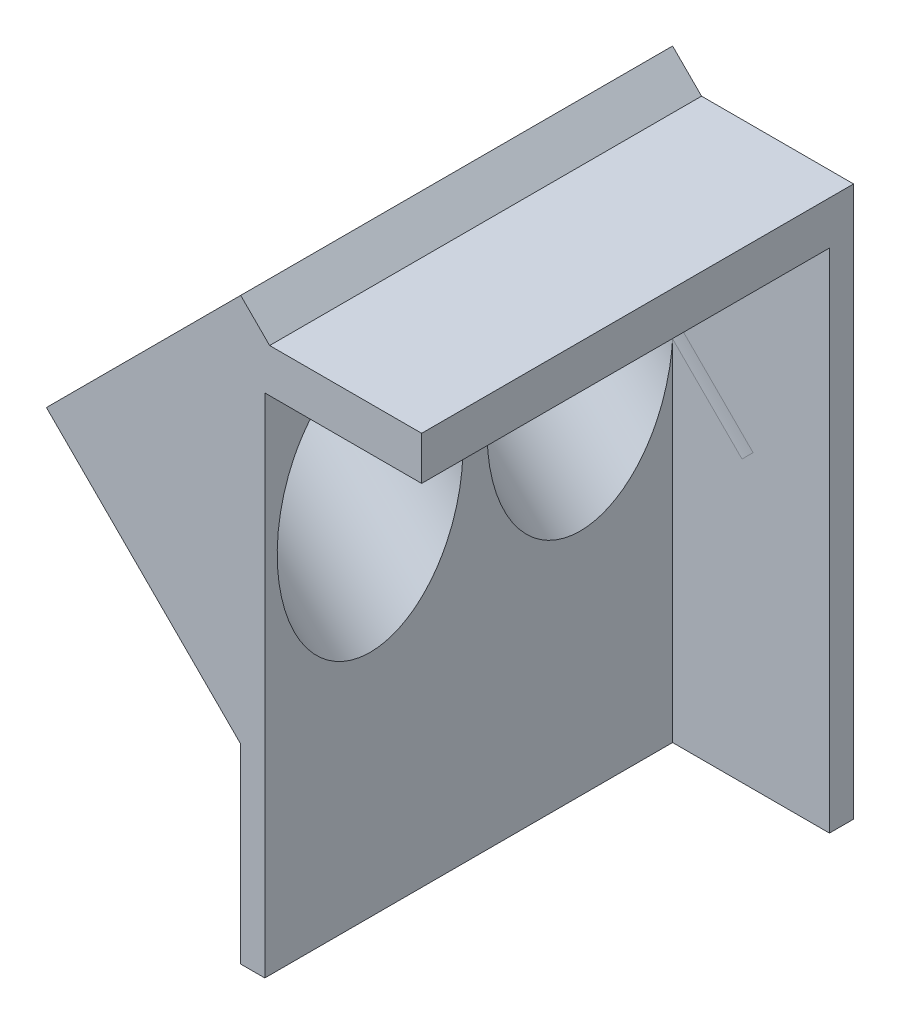
ISO-10303-21;
HEADER;
FILE_DESCRIPTION(('STEP AP214'),'2;1');
FILE_NAME('part.step','',(''),(''),'','','');
FILE_SCHEMA(('AUTOMOTIVE_DESIGN { 1 0 10303 214 1 1 1 1 }'));
ENDSEC;
DATA;
#1=APPLICATION_CONTEXT('core data for automotive mechanical design processes');
#2=APPLICATION_PROTOCOL_DEFINITION('international standard','automotive_design',2000,#1);
#3=PRODUCT_CONTEXT('',#1,'mechanical');
#4=PRODUCT('Part','Part','',(#3));
#5=PRODUCT_RELATED_PRODUCT_CATEGORY('part','',(#4));
#6=PRODUCT_DEFINITION_FORMATION('','',#4);
#7=PRODUCT_DEFINITION_CONTEXT('part definition',#1,'design');
#8=PRODUCT_DEFINITION('design','',#6,#7);
#9=PRODUCT_DEFINITION_SHAPE('','',#8);
#10=(LENGTH_UNIT() NAMED_UNIT(*) SI_UNIT(.MILLI.,.METRE.));
#11=(NAMED_UNIT(*) PLANE_ANGLE_UNIT() SI_UNIT($,.RADIAN.));
#12=(NAMED_UNIT(*) SI_UNIT($,.STERADIAN.) SOLID_ANGLE_UNIT());
#13=UNCERTAINTY_MEASURE_WITH_UNIT(LENGTH_MEASURE(1.E-05),#10,'distance_accuracy_value','');
#14=(GEOMETRIC_REPRESENTATION_CONTEXT(3) GLOBAL_UNCERTAINTY_ASSIGNED_CONTEXT((#13)) GLOBAL_UNIT_ASSIGNED_CONTEXT((#10,
#11,#12)) REPRESENTATION_CONTEXT('',''));
#15=CARTESIAN_POINT('',(0.,0.,0.));
#16=DIRECTION('',(0.,0.,1.));
#17=DIRECTION('',(1.,0.,0.));
#18=AXIS2_PLACEMENT_3D('',#15,#16,#17);
#19=CARTESIAN_POINT('',(103.,0.,0.));
#20=DIRECTION('',(1.,0.,0.));
#21=DIRECTION('',(0.,0.,-1.));
#22=AXIS2_PLACEMENT_3D('',#19,#20,#21);
#23=PLANE('',#22);
#24=DIRECTION('',(0.,0.,1.));
#25=VECTOR('',#24,1.);
#26=CARTESIAN_POINT('',(103.,-150.,0.));
#27=LINE('',#26,#25);
#28=CARTESIAN_POINT('',(103.,-150.,-179.));
#29=VERTEX_POINT('',#28);
#30=CARTESIAN_POINT('',(103.,-150.,-169.));
#31=VERTEX_POINT('',#30);
#32=EDGE_CURVE('E151',#29,#31,#27,.T.);
#33=ORIENTED_EDGE('',*,*,#32,.F.);
#34=DIRECTION('',(0.,1.,0.));
#35=VECTOR('',#34,1.);
#36=CARTESIAN_POINT('',(103.,90.0000000000001,-179.));
#37=LINE('',#36,#35);
#38=CARTESIAN_POINT('',(103.,78.0000000000001,-179.));
#39=VERTEX_POINT('',#38);
#40=EDGE_CURVE('E152',#29,#39,#37,.T.);
#41=ORIENTED_EDGE('',*,*,#40,.T.);
#42=DIRECTION('',(0.,0.,1.));
#43=VECTOR('',#42,1.);
#44=CARTESIAN_POINT('',(103.,78.0000000000001,0.));
#45=LINE('',#44,#43);
#46=CARTESIAN_POINT('',(103.,78.0000000000001,0.));
#47=VERTEX_POINT('',#46);
#48=EDGE_CURVE('E136',#39,#47,#45,.T.);
#49=ORIENTED_EDGE('',*,*,#48,.T.);
#50=DIRECTION('',(0.,-1.,0.));
#51=VECTOR('',#50,1.);
#52=CARTESIAN_POINT('',(103.,0.,0.));
#53=LINE('',#52,#51);
#54=CARTESIAN_POINT('',(103.,60.0000000000001,0.));
#55=VERTEX_POINT('',#54);
#56=EDGE_CURVE('E146',#47,#55,#53,.T.);
#57=ORIENTED_EDGE('',*,*,#56,.T.);
#58=DIRECTION('',(0.,0.,1.));
#59=VECTOR('',#58,1.);
#60=CARTESIAN_POINT('',(103.,60.0000000000001,0.));
#61=LINE('',#60,#59);
#62=CARTESIAN_POINT('',(103.,60.0000000000001,-169.));
#63=VERTEX_POINT('',#62);
#64=EDGE_CURVE('E162',#63,#55,#61,.T.);
#65=ORIENTED_EDGE('',*,*,#64,.F.);
#66=DIRECTION('',(0.,1.,0.));
#67=VECTOR('',#66,1.);
#68=CARTESIAN_POINT('',(103.,60.0000000000001,-169.));
#69=LINE('',#68,#67);
#70=EDGE_CURVE('E185',#31,#63,#69,.T.);
#71=ORIENTED_EDGE('',*,*,#70,.F.);
#72=EDGE_LOOP('',(#33,#41,#49,#57,#65,#71));
#73=FACE_BOUND('',#72,.T.);
#74=ADVANCED_FACE('F40',(#73),#23,.T.);
#75=CARTESIAN_POINT('',(69.0672798364517,-31.5672798364541,-43.6372308430156));
#76=DIRECTION('',(-0.707106781186548,0.707106781186547,0.));
#77=DIRECTION('',(-0.707106781186547,-0.707106781186548,0.));
#78=AXIS2_PLACEMENT_3D('',#75,#76,#77);
#79=CYLINDRICAL_SURFACE('',#78,38.5);
#80=CARTESIAN_POINT('',(-12.2500000000013,49.7499999999988,-43.6372308430156));
#81=DIRECTION('',(-0.707106781186548,0.707106781186547,0.));
#82=DIRECTION('',(-0.707106781186547,-0.707106781186548,0.));
#83=AXIS2_PLACEMENT_3D('',#80,#81,#82);
#84=CIRCLE('',#83,38.5);
#85=CARTESIAN_POINT('',(-39.4736110756833,22.5263889243167,-43.6372308430156));
#86=VERTEX_POINT('',#85);
#87=EDGE_CURVE('E171',#86,#86,#84,.T.);
#88=ORIENTED_EDGE('',*,*,#87,.T.);
#89=EDGE_LOOP('',(#88));
#90=FACE_BOUND('',#89,.T.);
#91=CARTESIAN_POINT('',(38.,-0.500000000002394,-43.6372308430156));
#92=DIRECTION('',(1.,0.,0.));
#93=DIRECTION('',(0.,1.,0.));
#94=AXIS2_PLACEMENT_3D('',#91,#92,#93);
#95=ELLIPSE('',#94,54.4472221513642,38.5);
#96=CARTESIAN_POINT('',(38.,53.9472221513618,-43.6372308430156));
#97=VERTEX_POINT('',#96);
#98=EDGE_CURVE('E208',#97,#97,#95,.F.);
#99=ORIENTED_EDGE('',*,*,#98,.F.);
#100=EDGE_LOOP('',(#99));
#101=FACE_BOUND('',#100,.T.);
#102=ADVANCED_FACE('F276',(#90,#101),#79,.F.);
#103=CARTESIAN_POINT('',(-50.,12.0000000000001,179.));
#104=DIRECTION('',(0.707106781186548,-0.707106781186548,0.));
#105=DIRECTION('',(0.,0.,-1.));
#106=AXIS2_PLACEMENT_3D('',#103,#104,#105);
#107=PLANE('',#106);
#108=DIRECTION('',(0.707106781186548,0.707106781186548,0.));
#109=VECTOR('',#108,1.);
#110=CARTESIAN_POINT('',(-50.,12.0000000000001,0.));
#111=LINE('',#110,#109);
#112=CARTESIAN_POINT('',(28.,90.0000000000001,0.));
#113=VERTEX_POINT('',#112);
#114=CARTESIAN_POINT('',(-52.5000000000008,9.49999999999929,0.));
#115=VERTEX_POINT('',#114);
#116=EDGE_CURVE('E165',#113,#115,#111,.F.);
#117=ORIENTED_EDGE('',*,*,#116,.F.);
#118=DIRECTION('',(0.,0.,1.));
#119=VECTOR('',#118,1.);
#120=CARTESIAN_POINT('',(28.,90.0000000000001,0.));
#121=LINE('',#120,#119);
#122=CARTESIAN_POINT('',(28.,90.0000000000001,-179.));
#123=VERTEX_POINT('',#122);
#124=EDGE_CURVE('E225',#123,#113,#121,.T.);
#125=ORIENTED_EDGE('',*,*,#124,.F.);
#126=DIRECTION('',(-0.707106781186548,-0.707106781186548,0.));
#127=VECTOR('',#126,1.);
#128=CARTESIAN_POINT('',(-50.,12.0000000000001,-179.));
#129=LINE('',#128,#127);
#130=CARTESIAN_POINT('',(-52.5000000000008,9.49999999999929,-179.));
#131=VERTEX_POINT('',#130);
#132=EDGE_CURVE('E228',#131,#123,#129,.F.);
#133=ORIENTED_EDGE('',*,*,#132,.F.);
#134=DIRECTION('',(0.,0.,1.));
#135=VECTOR('',#134,1.);
#136=CARTESIAN_POINT('',(-52.5000000000008,9.49999999999929,0.));
#137=LINE('',#136,#135);
#138=EDGE_CURVE('E233',#131,#115,#137,.T.);
#139=ORIENTED_EDGE('',*,*,#138,.T.);
#140=EDGE_LOOP('',(#117,#125,#133,#139));
#141=FACE_BOUND('',#140,.T.);
#142=ORIENTED_EDGE('',*,*,#87,.F.);
#143=EDGE_LOOP('',(#142));
#144=FACE_BOUND('',#143,.T.);
#145=CARTESIAN_POINT('',(-12.2500000000017,49.7499999999984,-130.637230843016));
#146=DIRECTION('',(-0.707106781186548,0.707106781186547,0.));
#147=DIRECTION('',(-0.707106781186547,-0.707106781186548,0.));
#148=AXIS2_PLACEMENT_3D('',#145,#146,#147);
#149=CIRCLE('',#148,38.5);
#150=CARTESIAN_POINT('',(-39.4736110756838,22.5263889243163,-130.637230843016));
#151=VERTEX_POINT('',#150);
#152=EDGE_CURVE('E216',#151,#151,#149,.T.);
#153=ORIENTED_EDGE('',*,*,#152,.F.);
#154=EDGE_LOOP('',(#153));
#155=FACE_BOUND('',#154,.T.);
#156=ADVANCED_FACE('F256',(#141,#144,#155),#107,.F.);
#157=CARTESIAN_POINT('',(-55.0000000000015,12.,0.));
#158=DIRECTION('',(-0.707106781186544,-0.707106781186551,0.));
#159=DIRECTION('',(0.,0.,-1.));
#160=AXIS2_PLACEMENT_3D('',#157,#158,#159);
#161=PLANE('',#160);
#162=DIRECTION('',(0.,0.,-1.));
#163=VECTOR('',#162,1.);
#164=CARTESIAN_POINT('',(28.,-71.0000000000006,-179.));
#165=LINE('',#164,#163);
#166=CARTESIAN_POINT('',(28.,-71.0000000000006,0.));
#167=VERTEX_POINT('',#166);
#168=CARTESIAN_POINT('',(28.,-71.0000000000006,-179.));
#169=VERTEX_POINT('',#168);
#170=EDGE_CURVE('E231',#167,#169,#165,.T.);
#171=ORIENTED_EDGE('',*,*,#170,.F.);
#172=DIRECTION('',(0.707106781186551,-0.707106781186544,0.));
#173=VECTOR('',#172,1.);
#174=CARTESIAN_POINT('',(-55.0000000000015,12.,0.));
#175=LINE('',#174,#173);
#176=EDGE_CURVE('E142',#167,#115,#175,.F.);
#177=ORIENTED_EDGE('',*,*,#176,.T.);
#178=ORIENTED_EDGE('',*,*,#138,.F.);
#179=DIRECTION('',(0.707106781186551,-0.707106781186544,0.));
#180=VECTOR('',#179,1.);
#181=CARTESIAN_POINT('',(-91.5000000000008,48.4999999999989,-179.));
#182=LINE('',#181,#180);
#183=EDGE_CURVE('E236',#169,#131,#182,.F.);
#184=ORIENTED_EDGE('',*,*,#183,.F.);
#185=EDGE_LOOP('',(#171,#177,#178,#184));
#186=FACE_BOUND('',#185,.T.);
#187=ADVANCED_FACE('F262',(#186),#161,.T.);
#188=CARTESIAN_POINT('',(28.,-150.,-179.));
#189=DIRECTION('',(-1.,0.,0.));
#190=DIRECTION('',(0.,0.,1.));
#191=AXIS2_PLACEMENT_3D('',#188,#189,#190);
#192=PLANE('',#191);
#193=DIRECTION('',(0.,-1.,0.));
#194=VECTOR('',#193,1.);
#195=CARTESIAN_POINT('',(28.,-150.,0.));
#196=LINE('',#195,#194);
#197=CARTESIAN_POINT('',(28.,-150.,0.));
#198=VERTEX_POINT('',#197);
#199=EDGE_CURVE('E245',#167,#198,#196,.T.);
#200=ORIENTED_EDGE('',*,*,#199,.F.);
#201=ORIENTED_EDGE('',*,*,#170,.T.);
#202=DIRECTION('',(0.,1.,0.));
#203=VECTOR('',#202,1.);
#204=CARTESIAN_POINT('',(28.,-150.,-179.));
#205=LINE('',#204,#203);
#206=CARTESIAN_POINT('',(28.,-150.,-179.));
#207=VERTEX_POINT('',#206);
#208=EDGE_CURVE('E222',#207,#169,#205,.T.);
#209=ORIENTED_EDGE('',*,*,#208,.F.);
#210=DIRECTION('',(0.,0.,1.));
#211=VECTOR('',#210,1.);
#212=CARTESIAN_POINT('',(28.,-150.,-179.));
#213=LINE('',#212,#211);
#214=EDGE_CURVE('E170',#207,#198,#213,.T.);
#215=ORIENTED_EDGE('',*,*,#214,.T.);
#216=EDGE_LOOP('',(#200,#201,#209,#215));
#217=FACE_BOUND('',#216,.T.);
#218=ADVANCED_FACE('F264',(#217),#192,.T.);
#219=CARTESIAN_POINT('',(69.0672798364513,-31.5672798364546,-130.637230843016));
#220=DIRECTION('',(-0.707106781186548,0.707106781186547,0.));
#221=DIRECTION('',(-0.707106781186547,-0.707106781186548,0.));
#222=AXIS2_PLACEMENT_3D('',#219,#220,#221);
#223=PLANE('',#222);
#224=CARTESIAN_POINT('',(69.0672798364513,-31.5672798364546,-130.637230843016));
#225=DIRECTION('',(-0.707106781186548,0.707106781186547,0.));
#226=DIRECTION('',(-0.707106781186547,-0.707106781186548,0.));
#227=AXIS2_PLACEMENT_3D('',#224,#225,#226);
#228=CIRCLE('',#227,38.5);
#229=CARTESIAN_POINT('',(71.3637926937989,-29.270766979107,-169.));
#230=VERTEX_POINT('',#229);
#231=CARTESIAN_POINT('',(66.7707669791037,-33.8637926938022,-169.));
#232=VERTEX_POINT('',#231);
#233=EDGE_CURVE('E206',#230,#232,#228,.T.);
#234=ORIENTED_EDGE('',*,*,#233,.T.);
#235=DIRECTION('',(0.707106781186547,0.707106781186548,0.));
#236=VECTOR('',#235,1.);
#237=CARTESIAN_POINT('',(69.0672798364513,-31.5672798364546,-169.));
#238=LINE('',#237,#236);
#239=EDGE_CURVE('E180',#232,#230,#238,.T.);
#240=ORIENTED_EDGE('',*,*,#239,.T.);
#241=EDGE_LOOP('',(#234,#240));
#242=FACE_BOUND('',#241,.T.);
#243=ADVANCED_FACE('F298',(#242),#223,.T.);
#244=CARTESIAN_POINT('',(69.0672798364513,-31.5672798364546,-130.637230843016));
#245=DIRECTION('',(-0.707106781186548,0.707106781186547,0.));
#246=DIRECTION('',(-0.707106781186547,-0.707106781186548,0.));
#247=AXIS2_PLACEMENT_3D('',#244,#245,#246);
#248=CYLINDRICAL_SURFACE('',#247,38.5);
#249=ORIENTED_EDGE('',*,*,#152,.T.);
#250=EDGE_LOOP('',(#249));
#251=FACE_BOUND('',#250,.T.);
#252=DIRECTION('',(-0.707106781186548,0.707106781186547,0.));
#253=VECTOR('',#252,1.);
#254=CARTESIAN_POINT('',(71.3637926937989,-29.270766979107,-169.));
#255=LINE('',#254,#253);
#256=CARTESIAN_POINT('',(38.,4.09302571469193,-169.));
#257=VERTEX_POINT('',#256);
#258=EDGE_CURVE('E199',#257,#230,#255,.F.);
#259=ORIENTED_EDGE('',*,*,#258,.F.);
#260=CARTESIAN_POINT('',(38.,-0.500000000003258,-130.637230843016));
#261=DIRECTION('',(1.,0.,0.));
#262=DIRECTION('',(0.,1.,0.));
#263=AXIS2_PLACEMENT_3D('',#260,#261,#262);
#264=ELLIPSE('',#263,54.4472221513642,38.5);
#265=CARTESIAN_POINT('',(38.,-5.09302571469845,-169.));
#266=VERTEX_POINT('',#265);
#267=EDGE_CURVE('E63',#266,#257,#264,.F.);
#268=ORIENTED_EDGE('',*,*,#267,.F.);
#269=DIRECTION('',(-0.707106781186548,0.707106781186547,0.));
#270=VECTOR('',#269,1.);
#271=CARTESIAN_POINT('',(66.7707669791037,-33.8637926938022,-169.));
#272=LINE('',#271,#270);
#273=EDGE_CURVE('E207',#232,#266,#272,.T.);
#274=ORIENTED_EDGE('',*,*,#273,.F.);
#275=ORIENTED_EDGE('',*,*,#233,.F.);
#276=EDGE_LOOP('',(#259,#268,#274,#275));
#277=FACE_BOUND('',#276,.T.);
#278=ADVANCED_FACE('F203',(#251,#277),#248,.F.);
#279=CARTESIAN_POINT('',(0.,-150.,0.));
#280=DIRECTION('',(0.,-1.,0.));
#281=DIRECTION('',(0.,0.,-1.));
#282=AXIS2_PLACEMENT_3D('',#279,#280,#281);
#283=PLANE('',#282);
#284=DIRECTION('',(1.,0.,0.));
#285=VECTOR('',#284,1.);
#286=CARTESIAN_POINT('',(28.,-150.,-179.));
#287=LINE('',#286,#285);
#288=EDGE_CURVE('E167',#207,#29,#287,.T.);
#289=ORIENTED_EDGE('',*,*,#288,.T.);
#290=ORIENTED_EDGE('',*,*,#32,.T.);
#291=DIRECTION('',(-1.,0.,0.));
#292=VECTOR('',#291,1.);
#293=CARTESIAN_POINT('',(0.,-150.,-169.));
#294=LINE('',#293,#292);
#295=CARTESIAN_POINT('',(38.,-150.,-169.));
#296=VERTEX_POINT('',#295);
#297=EDGE_CURVE('E44',#31,#296,#294,.T.);
#298=ORIENTED_EDGE('',*,*,#297,.T.);
#299=DIRECTION('',(0.,0.,1.));
#300=VECTOR('',#299,1.);
#301=CARTESIAN_POINT('',(38.,-150.,0.));
#302=LINE('',#301,#300);
#303=CARTESIAN_POINT('',(38.,-150.,0.));
#304=VERTEX_POINT('',#303);
#305=EDGE_CURVE('E11',#296,#304,#302,.T.);
#306=ORIENTED_EDGE('',*,*,#305,.T.);
#307=DIRECTION('',(1.,0.,0.));
#308=VECTOR('',#307,1.);
#309=CARTESIAN_POINT('',(0.,-150.,0.));
#310=LINE('',#309,#308);
#311=EDGE_CURVE('E163',#198,#304,#310,.T.);
#312=ORIENTED_EDGE('',*,*,#311,.F.);
#313=ORIENTED_EDGE('',*,*,#214,.F.);
#314=EDGE_LOOP('',(#289,#290,#298,#306,#312,#313));
#315=FACE_BOUND('',#314,.T.);
#316=ADVANCED_FACE('F189',(#315),#283,.T.);
#317=CARTESIAN_POINT('',(38.,60.0000000000001,0.));
#318=DIRECTION('',(1.,0.,0.));
#319=DIRECTION('',(0.,0.,-1.));
#320=AXIS2_PLACEMENT_3D('',#317,#318,#319);
#321=PLANE('',#320);
#322=DIRECTION('',(0.,1.,0.));
#323=VECTOR('',#322,1.);
#324=CARTESIAN_POINT('',(38.,60.0000000000001,0.));
#325=LINE('',#324,#323);
#326=CARTESIAN_POINT('',(38.,60.0000000000001,0.));
#327=VERTEX_POINT('',#326);
#328=EDGE_CURVE('E161',#304,#327,#325,.T.);
#329=ORIENTED_EDGE('',*,*,#328,.F.);
#330=ORIENTED_EDGE('',*,*,#305,.F.);
#331=DIRECTION('',(0.,-1.,0.));
#332=VECTOR('',#331,1.);
#333=CARTESIAN_POINT('',(38.,60.0000000000001,-169.));
#334=LINE('',#333,#332);
#335=EDGE_CURVE('E173',#266,#296,#334,.T.);
#336=ORIENTED_EDGE('',*,*,#335,.F.);
#337=ORIENTED_EDGE('',*,*,#267,.T.);
#338=CARTESIAN_POINT('',(38.,60.0000000000001,-169.));
#339=VERTEX_POINT('',#338);
#340=EDGE_CURVE('E177',#339,#257,#334,.T.);
#341=ORIENTED_EDGE('',*,*,#340,.F.);
#342=DIRECTION('',(0.,0.,1.));
#343=VECTOR('',#342,1.);
#344=CARTESIAN_POINT('',(38.,60.0000000000001,0.));
#345=LINE('',#344,#343);
#346=EDGE_CURVE('E172',#339,#327,#345,.T.);
#347=ORIENTED_EDGE('',*,*,#346,.T.);
#348=EDGE_LOOP('',(#329,#330,#336,#337,#341,#347));
#349=FACE_BOUND('',#348,.T.);
#350=ORIENTED_EDGE('',*,*,#98,.T.);
#351=EDGE_LOOP('',(#350));
#352=FACE_BOUND('',#351,.T.);
#353=ADVANCED_FACE('F196',(#349,#352),#321,.T.);
#354=CARTESIAN_POINT('',(0.,0.,0.));
#355=DIRECTION('',(0.,0.,-1.));
#356=DIRECTION('',(-1.,0.,0.));
#357=AXIS2_PLACEMENT_3D('',#354,#355,#356);
#358=PLANE('',#357);
#359=ORIENTED_EDGE('',*,*,#56,.F.);
#360=DIRECTION('',(1.,0.,0.));
#361=VECTOR('',#360,1.);
#362=CARTESIAN_POINT('',(0.,78.0000000000001,0.));
#363=LINE('',#362,#361);
#364=CARTESIAN_POINT('',(39.9999999999998,78.0000000000001,0.));
#365=VERTEX_POINT('',#364);
#366=EDGE_CURVE('E132',#365,#47,#363,.T.);
#367=ORIENTED_EDGE('',*,*,#366,.F.);
#368=DIRECTION('',(0.707106781186544,-0.707106781186551,0.));
#369=VECTOR('',#368,1.);
#370=CARTESIAN_POINT('',(41.,76.9999999999998,0.));
#371=LINE('',#370,#369);
#372=EDGE_CURVE('E244',#365,#113,#371,.F.);
#373=ORIENTED_EDGE('',*,*,#372,.T.);
#374=ORIENTED_EDGE('',*,*,#116,.T.);
#375=ORIENTED_EDGE('',*,*,#176,.F.);
#376=ORIENTED_EDGE('',*,*,#199,.T.);
#377=ORIENTED_EDGE('',*,*,#311,.T.);
#378=ORIENTED_EDGE('',*,*,#328,.T.);
#379=DIRECTION('',(1.,0.,0.));
#380=VECTOR('',#379,1.);
#381=CARTESIAN_POINT('',(0.,60.0000000000001,0.));
#382=LINE('',#381,#380);
#383=EDGE_CURVE('E149',#327,#55,#382,.T.);
#384=ORIENTED_EDGE('',*,*,#383,.T.);
#385=EDGE_LOOP('',(#359,#367,#373,#374,#375,#376,#377,#378,#384));
#386=FACE_BOUND('',#385,.T.);
#387=ADVANCED_FACE('F147',(#386),#358,.F.);
#388=CARTESIAN_POINT('',(0.,60.0000000000001,-169.));
#389=DIRECTION('',(0.,0.,1.));
#390=DIRECTION('',(1.,0.,0.));
#391=AXIS2_PLACEMENT_3D('',#388,#389,#390);
#392=PLANE('',#391);
#393=ORIENTED_EDGE('',*,*,#297,.F.);
#394=ORIENTED_EDGE('',*,*,#70,.T.);
#395=DIRECTION('',(-1.,0.,0.));
#396=VECTOR('',#395,1.);
#397=CARTESIAN_POINT('',(0.,60.0000000000001,-169.));
#398=LINE('',#397,#396);
#399=EDGE_CURVE('E56',#63,#339,#398,.T.);
#400=ORIENTED_EDGE('',*,*,#399,.T.);
#401=ORIENTED_EDGE('',*,*,#340,.T.);
#402=ORIENTED_EDGE('',*,*,#258,.T.);
#403=ORIENTED_EDGE('',*,*,#239,.F.);
#404=ORIENTED_EDGE('',*,*,#273,.T.);
#405=ORIENTED_EDGE('',*,*,#335,.T.);
#406=EDGE_LOOP('',(#393,#394,#400,#401,#402,#403,#404,#405));
#407=FACE_BOUND('',#406,.T.);
#408=ADVANCED_FACE('F193',(#407),#392,.T.);
#409=CARTESIAN_POINT('',(0.,60.0000000000001,0.));
#410=DIRECTION('',(0.,-1.,0.));
#411=DIRECTION('',(0.,0.,-1.));
#412=AXIS2_PLACEMENT_3D('',#409,#410,#411);
#413=PLANE('',#412);
#414=ORIENTED_EDGE('',*,*,#399,.F.);
#415=ORIENTED_EDGE('',*,*,#64,.T.);
#416=ORIENTED_EDGE('',*,*,#383,.F.);
#417=ORIENTED_EDGE('',*,*,#346,.F.);
#418=EDGE_LOOP('',(#414,#415,#416,#417));
#419=FACE_BOUND('',#418,.T.);
#420=ADVANCED_FACE('F42',(#419),#413,.T.);
#421=CARTESIAN_POINT('',(41.,76.9999999999998,179.));
#422=DIRECTION('',(-0.707106781186551,-0.707106781186544,0.));
#423=DIRECTION('',(0.,0.,1.));
#424=AXIS2_PLACEMENT_3D('',#421,#422,#423);
#425=PLANE('',#424);
#426=ORIENTED_EDGE('',*,*,#372,.F.);
#427=DIRECTION('',(0.,0.,-1.));
#428=VECTOR('',#427,1.);
#429=CARTESIAN_POINT('',(39.9999999999998,78.0000000000001,0.));
#430=LINE('',#429,#428);
#431=CARTESIAN_POINT('',(39.9999999999998,78.0000000000001,-179.));
#432=VERTEX_POINT('',#431);
#433=EDGE_CURVE('E138',#432,#365,#430,.F.);
#434=ORIENTED_EDGE('',*,*,#433,.F.);
#435=DIRECTION('',(-0.707106781186544,0.707106781186551,0.));
#436=VECTOR('',#435,1.);
#437=CARTESIAN_POINT('',(41.,76.9999999999998,-179.));
#438=LINE('',#437,#436);
#439=EDGE_CURVE('E239',#123,#432,#438,.F.);
#440=ORIENTED_EDGE('',*,*,#439,.F.);
#441=ORIENTED_EDGE('',*,*,#124,.T.);
#442=EDGE_LOOP('',(#426,#434,#440,#441));
#443=FACE_BOUND('',#442,.T.);
#444=ADVANCED_FACE('F254',(#443),#425,.F.);
#445=CARTESIAN_POINT('',(-50.,90.0000000000001,-179.));
#446=DIRECTION('',(0.,0.,1.));
#447=DIRECTION('',(1.,0.,0.));
#448=AXIS2_PLACEMENT_3D('',#445,#446,#447);
#449=PLANE('',#448);
#450=ORIENTED_EDGE('',*,*,#40,.F.);
#451=ORIENTED_EDGE('',*,*,#288,.F.);
#452=ORIENTED_EDGE('',*,*,#208,.T.);
#453=ORIENTED_EDGE('',*,*,#183,.T.);
#454=ORIENTED_EDGE('',*,*,#132,.T.);
#455=ORIENTED_EDGE('',*,*,#439,.T.);
#456=DIRECTION('',(-1.,0.,0.));
#457=VECTOR('',#456,1.);
#458=CARTESIAN_POINT('',(41.,78.0000000000001,-179.));
#459=LINE('',#458,#457);
#460=EDGE_CURVE('E169',#39,#432,#459,.T.);
#461=ORIENTED_EDGE('',*,*,#460,.F.);
#462=EDGE_LOOP('',(#450,#451,#452,#453,#454,#455,#461));
#463=FACE_BOUND('',#462,.T.);
#464=ADVANCED_FACE('F266',(#463),#449,.F.);
#465=CARTESIAN_POINT('',(0.,78.0000000000001,0.));
#466=DIRECTION('',(0.,-1.,0.));
#467=DIRECTION('',(0.,0.,-1.));
#468=AXIS2_PLACEMENT_3D('',#465,#466,#467);
#469=PLANE('',#468);
#470=ORIENTED_EDGE('',*,*,#48,.F.);
#471=ORIENTED_EDGE('',*,*,#460,.T.);
#472=ORIENTED_EDGE('',*,*,#433,.T.);
#473=ORIENTED_EDGE('',*,*,#366,.T.);
#474=EDGE_LOOP('',(#470,#471,#472,#473));
#475=FACE_BOUND('',#474,.T.);
#476=ADVANCED_FACE('F134',(#475),#469,.F.);
#477=CLOSED_SHELL('',(#74,#102,#156,#187,#218,#243,#278,#316,#353,#387,#408,#420,#444,#464,#476));
#478=MANIFOLD_SOLID_BREP('B2',#477);
#479=ADVANCED_BREP_SHAPE_REPRESENTATION('',(#18,#478),#14);
#480=SHAPE_DEFINITION_REPRESENTATION(#9,#479);
ENDSEC;
END-ISO-10303-21;
